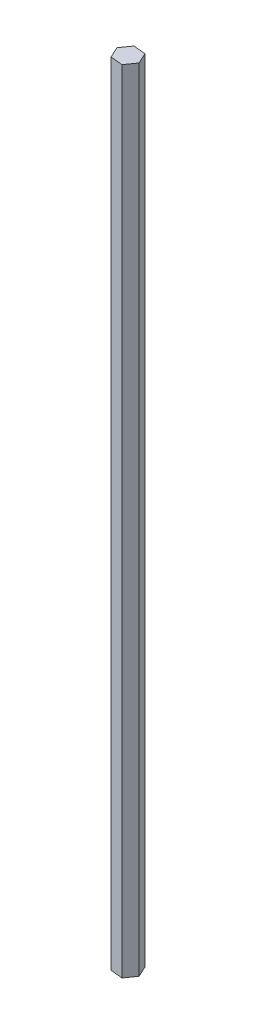
ISO-10303-21;
HEADER;
FILE_DESCRIPTION(('STEP AP214'),'2;1');
FILE_NAME('part.step','',(''),(''),'','','');
FILE_SCHEMA(('AUTOMOTIVE_DESIGN { 1 0 10303 214 1 1 1 1 }'));
ENDSEC;
DATA;
#1=APPLICATION_CONTEXT('core data for automotive mechanical design processes');
#2=APPLICATION_PROTOCOL_DEFINITION('international standard','automotive_design',2000,#1);
#3=PRODUCT_CONTEXT('',#1,'mechanical');
#4=PRODUCT('Part','Part','',(#3));
#5=PRODUCT_RELATED_PRODUCT_CATEGORY('part','',(#4));
#6=PRODUCT_DEFINITION_FORMATION('','',#4);
#7=PRODUCT_DEFINITION_CONTEXT('part definition',#1,'design');
#8=PRODUCT_DEFINITION('design','',#6,#7);
#9=PRODUCT_DEFINITION_SHAPE('','',#8);
#10=(LENGTH_UNIT() NAMED_UNIT(*) SI_UNIT(.MILLI.,.METRE.));
#11=(NAMED_UNIT(*) PLANE_ANGLE_UNIT() SI_UNIT($,.RADIAN.));
#12=(NAMED_UNIT(*) SI_UNIT($,.STERADIAN.) SOLID_ANGLE_UNIT());
#13=UNCERTAINTY_MEASURE_WITH_UNIT(LENGTH_MEASURE(1.E-05),#10,'distance_accuracy_value','');
#14=(GEOMETRIC_REPRESENTATION_CONTEXT(3) GLOBAL_UNCERTAINTY_ASSIGNED_CONTEXT((#13)) GLOBAL_UNIT_ASSIGNED_CONTEXT((#10,
#11,#12)) REPRESENTATION_CONTEXT('',''));
#15=CARTESIAN_POINT('',(0.,0.,0.));
#16=DIRECTION('',(0.,0.,1.));
#17=DIRECTION('',(1.,0.,0.));
#18=AXIS2_PLACEMENT_3D('',#15,#16,#17);
#19=CARTESIAN_POINT('',(-4.24196048250777,476.25,5.98072776492759));
#20=DIRECTION('',(0.0931872871035777,0.,-0.995648597408883));
#21=DIRECTION('',(-0.995648597408883,0.,-0.0931872871035777));
#22=AXIS2_PLACEMENT_3D('',#19,#20,#21);
#23=PLANE('',#22);
#24=DIRECTION('',(0.995648597408883,0.,0.0931872871035777));
#25=VECTOR('',#24,1.);
#26=CARTESIAN_POINT('',(-4.24196048250777,0.,5.98072776492759));
#27=LINE('',#26,#25);
#28=CARTESIAN_POINT('',(-4.24196048250777,0.,5.98072776492759));
#29=VERTEX_POINT('',#28);
#30=CARTESIAN_POINT('',(3.05848193629233,0.,6.66400942216522));
#31=VERTEX_POINT('',#30);
#32=EDGE_CURVE('E133',#29,#31,#27,.T.);
#33=ORIENTED_EDGE('',*,*,#32,.T.);
#34=DIRECTION('',(0.,-1.,0.));
#35=VECTOR('',#34,1.);
#36=CARTESIAN_POINT('',(3.05848193629233,476.25,6.66400942216522));
#37=LINE('',#36,#35);
#38=CARTESIAN_POINT('',(3.05848193629233,476.25,6.66400942216522));
#39=VERTEX_POINT('',#38);
#40=EDGE_CURVE('E11',#39,#31,#37,.T.);
#41=ORIENTED_EDGE('',*,*,#40,.F.);
#42=DIRECTION('',(0.995648597408883,0.,0.0931872871035777));
#43=VECTOR('',#42,1.);
#44=CARTESIAN_POINT('',(-4.24196048250777,476.25,5.98072776492759));
#45=LINE('',#44,#43);
#46=CARTESIAN_POINT('',(-4.24196048250777,476.25,5.98072776492759));
#47=VERTEX_POINT('',#46);
#48=EDGE_CURVE('E148',#47,#39,#45,.T.);
#49=ORIENTED_EDGE('',*,*,#48,.F.);
#50=DIRECTION('',(0.,-1.,0.));
#51=VECTOR('',#50,1.);
#52=CARTESIAN_POINT('',(-4.24196048250777,476.25,5.98072776492759));
#53=LINE('',#52,#51);
#54=EDGE_CURVE('E129',#47,#29,#53,.T.);
#55=ORIENTED_EDGE('',*,*,#54,.T.);
#56=EDGE_LOOP('',(#33,#41,#49,#55));
#57=FACE_BOUND('',#56,.T.);
#58=ADVANCED_FACE('F43',(#57),#23,.F.);
#59=CARTESIAN_POINT('',(3.05848193629233,476.25,6.66400942216522));
#60=DIRECTION('',(-0.815663335046649,0.,-0.578526856645893));
#61=DIRECTION('',(-0.578526856645893,0.,0.815663335046649));
#62=AXIS2_PLACEMENT_3D('',#59,#60,#61);
#63=PLANE('',#62);
#64=DIRECTION('',(0.578526856645893,0.,-0.815663335046649));
#65=VECTOR('',#64,1.);
#66=CARTESIAN_POINT('',(3.05848193629233,0.,6.66400942216522));
#67=LINE('',#66,#65);
#68=CARTESIAN_POINT('',(7.3004424188001,0.,0.683281657237625));
#69=VERTEX_POINT('',#68);
#70=EDGE_CURVE('E136',#31,#69,#67,.T.);
#71=ORIENTED_EDGE('',*,*,#70,.T.);
#72=DIRECTION('',(0.,-1.,0.));
#73=VECTOR('',#72,1.);
#74=CARTESIAN_POINT('',(7.3004424188001,476.25,0.683281657237625));
#75=LINE('',#74,#73);
#76=CARTESIAN_POINT('',(7.3004424188001,476.25,0.683281657237625));
#77=VERTEX_POINT('',#76);
#78=EDGE_CURVE('E52',#77,#69,#75,.T.);
#79=ORIENTED_EDGE('',*,*,#78,.F.);
#80=DIRECTION('',(0.578526856645893,0.,-0.815663335046649));
#81=VECTOR('',#80,1.);
#82=CARTESIAN_POINT('',(3.05848193629233,476.25,6.66400942216522));
#83=LINE('',#82,#81);
#84=EDGE_CURVE('E101',#39,#77,#83,.T.);
#85=ORIENTED_EDGE('',*,*,#84,.F.);
#86=ORIENTED_EDGE('',*,*,#40,.T.);
#87=EDGE_LOOP('',(#71,#79,#85,#86));
#88=FACE_BOUND('',#87,.T.);
#89=ADVANCED_FACE('F176',(#88),#63,.F.);
#90=CARTESIAN_POINT('',(7.3004424188001,476.25,0.683281657237625));
#91=DIRECTION('',(-0.908850622150226,0.,0.41712174076299));
#92=DIRECTION('',(0.417121740762989,0.,0.908850622150226));
#93=AXIS2_PLACEMENT_3D('',#90,#91,#92);
#94=PLANE('',#93);
#95=DIRECTION('',(-0.417121740762989,0.,-0.908850622150226));
#96=VECTOR('',#95,1.);
#97=CARTESIAN_POINT('',(7.3004424188001,0.,0.683281657237625));
#98=LINE('',#97,#96);
#99=CARTESIAN_POINT('',(4.24196048250777,0.,-5.98072776492759));
#100=VERTEX_POINT('',#99);
#101=EDGE_CURVE('E139',#69,#100,#98,.T.);
#102=ORIENTED_EDGE('',*,*,#101,.T.);
#103=DIRECTION('',(0.,-1.,0.));
#104=VECTOR('',#103,1.);
#105=CARTESIAN_POINT('',(4.24196048250777,476.25,-5.98072776492759));
#106=LINE('',#105,#104);
#107=CARTESIAN_POINT('',(4.24196048250777,476.25,-5.98072776492759));
#108=VERTEX_POINT('',#107);
#109=EDGE_CURVE('E124',#108,#100,#106,.T.);
#110=ORIENTED_EDGE('',*,*,#109,.F.);
#111=DIRECTION('',(-0.417121740762989,0.,-0.908850622150226));
#112=VECTOR('',#111,1.);
#113=CARTESIAN_POINT('',(7.3004424188001,476.25,0.683281657237625));
#114=LINE('',#113,#112);
#115=EDGE_CURVE('E114',#77,#108,#114,.T.);
#116=ORIENTED_EDGE('',*,*,#115,.F.);
#117=ORIENTED_EDGE('',*,*,#78,.T.);
#118=EDGE_LOOP('',(#102,#110,#116,#117));
#119=FACE_BOUND('',#118,.T.);
#120=ADVANCED_FACE('F158',(#119),#94,.F.);
#121=CARTESIAN_POINT('',(4.24196048250777,476.25,-5.98072776492759));
#122=DIRECTION('',(-0.0931872871035775,0.,0.995648597408883));
#123=DIRECTION('',(0.995648597408883,0.,0.0931872871035776));
#124=AXIS2_PLACEMENT_3D('',#121,#122,#123);
#125=PLANE('',#124);
#126=DIRECTION('',(-0.995648597408883,0.,-0.0931872871035776));
#127=VECTOR('',#126,1.);
#128=CARTESIAN_POINT('',(4.24196048250777,0.,-5.98072776492759));
#129=LINE('',#128,#127);
#130=CARTESIAN_POINT('',(-3.05848193629233,0.,-6.66400942216522));
#131=VERTEX_POINT('',#130);
#132=EDGE_CURVE('E122',#100,#131,#129,.T.);
#133=ORIENTED_EDGE('',*,*,#132,.T.);
#134=DIRECTION('',(0.,-1.,0.));
#135=VECTOR('',#134,1.);
#136=CARTESIAN_POINT('',(-3.05848193629233,476.25,-6.66400942216522));
#137=LINE('',#136,#135);
#138=CARTESIAN_POINT('',(-3.05848193629233,476.25,-6.66400942216522));
#139=VERTEX_POINT('',#138);
#140=EDGE_CURVE('E119',#139,#131,#137,.T.);
#141=ORIENTED_EDGE('',*,*,#140,.F.);
#142=DIRECTION('',(-0.995648597408883,0.,-0.0931872871035776));
#143=VECTOR('',#142,1.);
#144=CARTESIAN_POINT('',(4.24196048250777,476.25,-5.98072776492759));
#145=LINE('',#144,#143);
#146=EDGE_CURVE('E108',#108,#139,#145,.T.);
#147=ORIENTED_EDGE('',*,*,#146,.F.);
#148=ORIENTED_EDGE('',*,*,#109,.T.);
#149=EDGE_LOOP('',(#133,#141,#147,#148));
#150=FACE_BOUND('',#149,.T.);
#151=ADVANCED_FACE('F120',(#150),#125,.F.);
#152=CARTESIAN_POINT('',(-3.05848193629233,476.25,-6.66400942216522));
#153=DIRECTION('',(0.815663335046649,0.,0.578526856645894));
#154=DIRECTION('',(0.578526856645893,0.,-0.815663335046649));
#155=AXIS2_PLACEMENT_3D('',#152,#153,#154);
#156=PLANE('',#155);
#157=DIRECTION('',(-0.578526856645893,0.,0.815663335046649));
#158=VECTOR('',#157,1.);
#159=CARTESIAN_POINT('',(-3.05848193629233,0.,-6.66400942216522));
#160=LINE('',#159,#158);
#161=CARTESIAN_POINT('',(-7.30044241880011,0.,-0.683281657237626));
#162=VERTEX_POINT('',#161);
#163=EDGE_CURVE('E87',#131,#162,#160,.T.);
#164=ORIENTED_EDGE('',*,*,#163,.T.);
#165=DIRECTION('',(0.,-1.,0.));
#166=VECTOR('',#165,1.);
#167=CARTESIAN_POINT('',(-7.30044241880011,476.25,-0.683281657237626));
#168=LINE('',#167,#166);
#169=CARTESIAN_POINT('',(-7.30044241880011,476.25,-0.683281657237626));
#170=VERTEX_POINT('',#169);
#171=EDGE_CURVE('E125',#170,#162,#168,.T.);
#172=ORIENTED_EDGE('',*,*,#171,.F.);
#173=DIRECTION('',(-0.578526856645893,0.,0.815663335046649));
#174=VECTOR('',#173,1.);
#175=CARTESIAN_POINT('',(-3.05848193629233,476.25,-6.66400942216522));
#176=LINE('',#175,#174);
#177=EDGE_CURVE('E112',#139,#170,#176,.T.);
#178=ORIENTED_EDGE('',*,*,#177,.F.);
#179=ORIENTED_EDGE('',*,*,#140,.T.);
#180=EDGE_LOOP('',(#164,#172,#178,#179));
#181=FACE_BOUND('',#180,.T.);
#182=ADVANCED_FACE('F127',(#181),#156,.F.);
#183=CARTESIAN_POINT('',(-7.30044241880011,476.25,-0.683281657237626));
#184=DIRECTION('',(0.908850622150226,0.,-0.41712174076299));
#185=DIRECTION('',(-0.41712174076299,0.,-0.908850622150226));
#186=AXIS2_PLACEMENT_3D('',#183,#184,#185);
#187=PLANE('',#186);
#188=DIRECTION('',(0.41712174076299,0.,0.908850622150226));
#189=VECTOR('',#188,1.);
#190=CARTESIAN_POINT('',(-7.30044241880011,0.,-0.683281657237626));
#191=LINE('',#190,#189);
#192=EDGE_CURVE('E93',#162,#29,#191,.T.);
#193=ORIENTED_EDGE('',*,*,#192,.T.);
#194=ORIENTED_EDGE('',*,*,#54,.F.);
#195=DIRECTION('',(0.41712174076299,0.,0.908850622150226));
#196=VECTOR('',#195,1.);
#197=CARTESIAN_POINT('',(-7.30044241880011,476.25,-0.683281657237626));
#198=LINE('',#197,#196);
#199=EDGE_CURVE('E60',#170,#47,#198,.T.);
#200=ORIENTED_EDGE('',*,*,#199,.F.);
#201=ORIENTED_EDGE('',*,*,#171,.T.);
#202=EDGE_LOOP('',(#193,#194,#200,#201));
#203=FACE_BOUND('',#202,.T.);
#204=ADVANCED_FACE('F165',(#203),#187,.F.);
#205=CARTESIAN_POINT('',(0.,476.25,0.));
#206=DIRECTION('',(0.,1.,0.));
#207=DIRECTION('',(0.,0.,1.));
#208=AXIS2_PLACEMENT_3D('',#205,#206,#207);
#209=PLANE('',#208);
#210=ORIENTED_EDGE('',*,*,#48,.T.);
#211=ORIENTED_EDGE('',*,*,#84,.T.);
#212=ORIENTED_EDGE('',*,*,#115,.T.);
#213=ORIENTED_EDGE('',*,*,#146,.T.);
#214=ORIENTED_EDGE('',*,*,#177,.T.);
#215=ORIENTED_EDGE('',*,*,#199,.T.);
#216=EDGE_LOOP('',(#210,#211,#212,#213,#214,#215));
#217=FACE_BOUND('',#216,.T.);
#218=ADVANCED_FACE('F110',(#217),#209,.T.);
#219=CARTESIAN_POINT('',(0.,0.,0.));
#220=DIRECTION('',(0.,1.,0.));
#221=DIRECTION('',(0.,0.,1.));
#222=AXIS2_PLACEMENT_3D('',#219,#220,#221);
#223=PLANE('',#222);
#224=ORIENTED_EDGE('',*,*,#32,.F.);
#225=ORIENTED_EDGE('',*,*,#192,.F.);
#226=ORIENTED_EDGE('',*,*,#163,.F.);
#227=ORIENTED_EDGE('',*,*,#132,.F.);
#228=ORIENTED_EDGE('',*,*,#101,.F.);
#229=ORIENTED_EDGE('',*,*,#70,.F.);
#230=EDGE_LOOP('',(#224,#225,#226,#227,#228,#229));
#231=FACE_BOUND('',#230,.T.);
#232=ADVANCED_FACE('F161',(#231),#223,.F.);
#233=CLOSED_SHELL('',(#58,#89,#120,#151,#182,#204,#218,#232));
#234=MANIFOLD_SOLID_BREP('B2',#233);
#235=ADVANCED_BREP_SHAPE_REPRESENTATION('',(#18,#234),#14);
#236=SHAPE_DEFINITION_REPRESENTATION(#9,#235);
ENDSEC;
END-ISO-10303-21;
